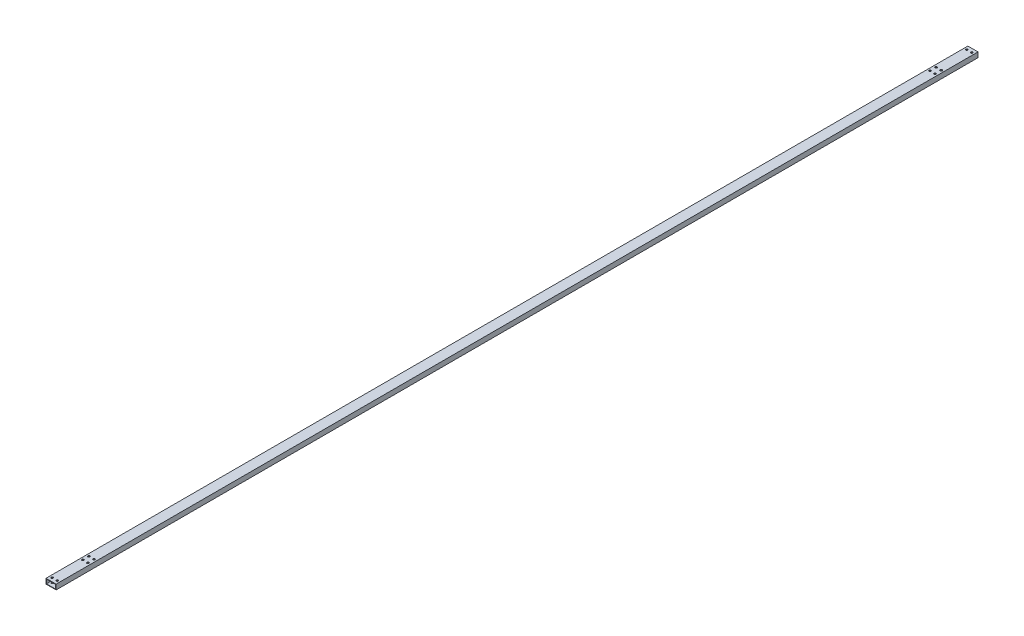
ISO-10303-21;
HEADER;
FILE_DESCRIPTION(('STEP AP214'),'2;1');
FILE_NAME('part.step','',(''),(''),'','','');
FILE_SCHEMA(('AUTOMOTIVE_DESIGN { 1 0 10303 214 1 1 1 1 }'));
ENDSEC;
DATA;
#1=APPLICATION_CONTEXT('core data for automotive mechanical design processes');
#2=APPLICATION_PROTOCOL_DEFINITION('international standard','automotive_design',2000,#1);
#3=PRODUCT_CONTEXT('',#1,'mechanical');
#4=PRODUCT('Part','Part','',(#3));
#5=PRODUCT_RELATED_PRODUCT_CATEGORY('part','',(#4));
#6=PRODUCT_DEFINITION_FORMATION('','',#4);
#7=PRODUCT_DEFINITION_CONTEXT('part definition',#1,'design');
#8=PRODUCT_DEFINITION('design','',#6,#7);
#9=PRODUCT_DEFINITION_SHAPE('','',#8);
#10=(LENGTH_UNIT() NAMED_UNIT(*) SI_UNIT(.MILLI.,.METRE.));
#11=(NAMED_UNIT(*) PLANE_ANGLE_UNIT() SI_UNIT($,.RADIAN.));
#12=(NAMED_UNIT(*) SI_UNIT($,.STERADIAN.) SOLID_ANGLE_UNIT());
#13=UNCERTAINTY_MEASURE_WITH_UNIT(LENGTH_MEASURE(1.E-05),#10,'distance_accuracy_value','');
#14=(GEOMETRIC_REPRESENTATION_CONTEXT(3) GLOBAL_UNCERTAINTY_ASSIGNED_CONTEXT((#13)) GLOBAL_UNIT_ASSIGNED_CONTEXT((#10,
#11,#12)) REPRESENTATION_CONTEXT('',''));
#15=CARTESIAN_POINT('',(0.,0.,0.));
#16=DIRECTION('',(0.,0.,1.));
#17=DIRECTION('',(1.,0.,0.));
#18=AXIS2_PLACEMENT_3D('',#15,#16,#17);
#19=CARTESIAN_POINT('',(0.,0.,1820.));
#20=DIRECTION('',(0.,0.,-1.));
#21=DIRECTION('',(-1.,0.,0.));
#22=AXIS2_PLACEMENT_3D('',#19,#20,#21);
#23=PLANE('',#22);
#24=DIRECTION('',(0.,-1.,0.));
#25=VECTOR('',#24,1.);
#26=CARTESIAN_POINT('',(0.,0.,1820.));
#27=LINE('',#26,#25);
#28=CARTESIAN_POINT('',(0.,10.,1820.));
#29=VERTEX_POINT('',#28);
#30=CARTESIAN_POINT('',(0.,0.,1820.));
#31=VERTEX_POINT('',#30);
#32=EDGE_CURVE('E140',#29,#31,#27,.T.);
#33=ORIENTED_EDGE('',*,*,#32,.T.);
#34=DIRECTION('',(1.,0.,0.));
#35=VECTOR('',#34,1.);
#36=CARTESIAN_POINT('',(0.,0.,1820.));
#37=LINE('',#36,#35);
#38=CARTESIAN_POINT('',(20.,0.,1820.));
#39=VERTEX_POINT('',#38);
#40=EDGE_CURVE('E143',#31,#39,#37,.T.);
#41=ORIENTED_EDGE('',*,*,#40,.T.);
#42=DIRECTION('',(0.,1.,0.));
#43=VECTOR('',#42,1.);
#44=CARTESIAN_POINT('',(20.,0.,1820.));
#45=LINE('',#44,#43);
#46=CARTESIAN_POINT('',(20.,10.,1820.));
#47=VERTEX_POINT('',#46);
#48=EDGE_CURVE('E146',#39,#47,#45,.T.);
#49=ORIENTED_EDGE('',*,*,#48,.T.);
#50=DIRECTION('',(-1.,0.,0.));
#51=VECTOR('',#50,1.);
#52=CARTESIAN_POINT('',(0.,10.,1820.));
#53=LINE('',#52,#51);
#54=EDGE_CURVE('E148',#47,#29,#53,.T.);
#55=ORIENTED_EDGE('',*,*,#54,.T.);
#56=EDGE_LOOP('',(#33,#41,#49,#55));
#57=FACE_BOUND('',#56,.T.);
#58=DIRECTION('',(0.,-1.,0.));
#59=VECTOR('',#58,1.);
#60=CARTESIAN_POINT('',(1.,1.,1820.));
#61=LINE('',#60,#59);
#62=CARTESIAN_POINT('',(1.,9.,1820.));
#63=VERTEX_POINT('',#62);
#64=CARTESIAN_POINT('',(1.,1.,1820.));
#65=VERTEX_POINT('',#64);
#66=EDGE_CURVE('E102',#63,#65,#61,.T.);
#67=ORIENTED_EDGE('',*,*,#66,.F.);
#68=DIRECTION('',(-1.,0.,0.));
#69=VECTOR('',#68,1.);
#70=CARTESIAN_POINT('',(1.,9.,1820.));
#71=LINE('',#70,#69);
#72=CARTESIAN_POINT('',(19.,9.,1820.));
#73=VERTEX_POINT('',#72);
#74=EDGE_CURVE('E124',#73,#63,#71,.T.);
#75=ORIENTED_EDGE('',*,*,#74,.F.);
#76=DIRECTION('',(0.,1.,0.));
#77=VECTOR('',#76,1.);
#78=CARTESIAN_POINT('',(19.,1.,1820.));
#79=LINE('',#78,#77);
#80=CARTESIAN_POINT('',(19.,1.,1820.));
#81=VERTEX_POINT('',#80);
#82=EDGE_CURVE('E122',#81,#73,#79,.T.);
#83=ORIENTED_EDGE('',*,*,#82,.F.);
#84=DIRECTION('',(1.,0.,0.));
#85=VECTOR('',#84,1.);
#86=CARTESIAN_POINT('',(1.,1.,1820.));
#87=LINE('',#86,#85);
#88=EDGE_CURVE('E110',#65,#81,#87,.T.);
#89=ORIENTED_EDGE('',*,*,#88,.F.);
#90=EDGE_LOOP('',(#67,#75,#83,#89));
#91=FACE_BOUND('',#90,.T.);
#92=ADVANCED_FACE('F35',(#57,#91),#23,.F.);
#93=CARTESIAN_POINT('',(0.,0.,0.));
#94=DIRECTION('',(0.,0.,-1.));
#95=DIRECTION('',(-1.,0.,0.));
#96=AXIS2_PLACEMENT_3D('',#93,#94,#95);
#97=PLANE('',#96);
#98=DIRECTION('',(0.,-1.,0.));
#99=VECTOR('',#98,1.);
#100=CARTESIAN_POINT('',(0.,0.,0.));
#101=LINE('',#100,#99);
#102=CARTESIAN_POINT('',(0.,10.,0.));
#103=VERTEX_POINT('',#102);
#104=CARTESIAN_POINT('',(0.,0.,0.));
#105=VERTEX_POINT('',#104);
#106=EDGE_CURVE('E118',#103,#105,#101,.T.);
#107=ORIENTED_EDGE('',*,*,#106,.F.);
#108=DIRECTION('',(-1.,0.,0.));
#109=VECTOR('',#108,1.);
#110=CARTESIAN_POINT('',(0.,10.,0.));
#111=LINE('',#110,#109);
#112=CARTESIAN_POINT('',(20.,10.,0.));
#113=VERTEX_POINT('',#112);
#114=EDGE_CURVE('E144',#113,#103,#111,.T.);
#115=ORIENTED_EDGE('',*,*,#114,.F.);
#116=DIRECTION('',(0.,1.,0.));
#117=VECTOR('',#116,1.);
#118=CARTESIAN_POINT('',(20.,0.,0.));
#119=LINE('',#118,#117);
#120=CARTESIAN_POINT('',(20.,0.,0.));
#121=VERTEX_POINT('',#120);
#122=EDGE_CURVE('E155',#121,#113,#119,.T.);
#123=ORIENTED_EDGE('',*,*,#122,.F.);
#124=DIRECTION('',(1.,0.,0.));
#125=VECTOR('',#124,1.);
#126=CARTESIAN_POINT('',(0.,0.,0.));
#127=LINE('',#126,#125);
#128=EDGE_CURVE('E153',#105,#121,#127,.T.);
#129=ORIENTED_EDGE('',*,*,#128,.F.);
#130=EDGE_LOOP('',(#107,#115,#123,#129));
#131=FACE_BOUND('',#130,.T.);
#132=DIRECTION('',(-1.,0.,0.));
#133=VECTOR('',#132,1.);
#134=CARTESIAN_POINT('',(1.,9.,0.));
#135=LINE('',#134,#133);
#136=CARTESIAN_POINT('',(19.,9.,0.));
#137=VERTEX_POINT('',#136);
#138=CARTESIAN_POINT('',(1.,9.,0.));
#139=VERTEX_POINT('',#138);
#140=EDGE_CURVE('E111',#137,#139,#135,.T.);
#141=ORIENTED_EDGE('',*,*,#140,.T.);
#142=DIRECTION('',(0.,-1.,0.));
#143=VECTOR('',#142,1.);
#144=CARTESIAN_POINT('',(1.,1.,0.));
#145=LINE('',#144,#143);
#146=CARTESIAN_POINT('',(1.,1.,0.));
#147=VERTEX_POINT('',#146);
#148=EDGE_CURVE('E60',#139,#147,#145,.T.);
#149=ORIENTED_EDGE('',*,*,#148,.T.);
#150=DIRECTION('',(1.,0.,0.));
#151=VECTOR('',#150,1.);
#152=CARTESIAN_POINT('',(1.,1.,0.));
#153=LINE('',#152,#151);
#154=CARTESIAN_POINT('',(19.,1.,0.));
#155=VERTEX_POINT('',#154);
#156=EDGE_CURVE('E117',#147,#155,#153,.T.);
#157=ORIENTED_EDGE('',*,*,#156,.T.);
#158=DIRECTION('',(0.,1.,0.));
#159=VECTOR('',#158,1.);
#160=CARTESIAN_POINT('',(19.,1.,0.));
#161=LINE('',#160,#159);
#162=EDGE_CURVE('E132',#155,#137,#161,.T.);
#163=ORIENTED_EDGE('',*,*,#162,.T.);
#164=EDGE_LOOP('',(#141,#149,#157,#163));
#165=FACE_BOUND('',#164,.T.);
#166=ADVANCED_FACE('F255',(#131,#165),#97,.T.);
#167=CARTESIAN_POINT('',(0.,0.,1820.));
#168=DIRECTION('',(1.,0.,0.));
#169=DIRECTION('',(0.,0.,-1.));
#170=AXIS2_PLACEMENT_3D('',#167,#168,#169);
#171=PLANE('',#170);
#172=ORIENTED_EDGE('',*,*,#106,.T.);
#173=DIRECTION('',(0.,0.,-1.));
#174=VECTOR('',#173,1.);
#175=CARTESIAN_POINT('',(0.,0.,1820.));
#176=LINE('',#175,#174);
#177=EDGE_CURVE('E11',#31,#105,#176,.T.);
#178=ORIENTED_EDGE('',*,*,#177,.F.);
#179=ORIENTED_EDGE('',*,*,#32,.F.);
#180=DIRECTION('',(0.,0.,-1.));
#181=VECTOR('',#180,1.);
#182=CARTESIAN_POINT('',(0.,10.,1820.));
#183=LINE('',#182,#181);
#184=EDGE_CURVE('E150',#29,#103,#183,.T.);
#185=ORIENTED_EDGE('',*,*,#184,.T.);
#186=EDGE_LOOP('',(#172,#178,#179,#185));
#187=FACE_BOUND('',#186,.T.);
#188=ADVANCED_FACE('F37',(#187),#171,.F.);
#189=CARTESIAN_POINT('',(0.,0.,1820.));
#190=DIRECTION('',(0.,1.,0.));
#191=DIRECTION('',(0.,0.,1.));
#192=AXIS2_PLACEMENT_3D('',#189,#190,#191);
#193=PLANE('',#192);
#194=CARTESIAN_POINT('',(15.0000000000001,0.,67.8000000000008));
#195=DIRECTION('',(0.,-1.,0.));
#196=DIRECTION('',(0.,0.,-1.));
#197=AXIS2_PLACEMENT_3D('',#194,#195,#196);
#198=CIRCLE('',#197,2.);
#199=CARTESIAN_POINT('',(15.0000000000001,0.,65.8000000000008));
#200=VERTEX_POINT('',#199);
#201=EDGE_CURVE('E291',#200,#200,#198,.T.);
#202=ORIENTED_EDGE('',*,*,#201,.F.);
#203=EDGE_LOOP('',(#202));
#204=FACE_BOUND('',#203,.T.);
#205=CARTESIAN_POINT('',(15.0000000000001,0.,7.20000000000084));
#206=DIRECTION('',(0.,-1.,0.));
#207=DIRECTION('',(0.,0.,-1.));
#208=AXIS2_PLACEMENT_3D('',#205,#206,#207);
#209=CIRCLE('',#208,2.00000000000001);
#210=CARTESIAN_POINT('',(15.0000000000001,0.,5.20000000000084));
#211=VERTEX_POINT('',#210);
#212=EDGE_CURVE('E295',#211,#211,#209,.T.);
#213=ORIENTED_EDGE('',*,*,#212,.F.);
#214=EDGE_LOOP('',(#213));
#215=FACE_BOUND('',#214,.T.);
#216=CARTESIAN_POINT('',(5.00000000000005,0.,7.20000000000084));
#217=DIRECTION('',(0.,-1.,0.));
#218=DIRECTION('',(0.,0.,-1.));
#219=AXIS2_PLACEMENT_3D('',#216,#217,#218);
#220=CIRCLE('',#219,2.);
#221=CARTESIAN_POINT('',(5.00000000000005,0.,5.20000000000084));
#222=VERTEX_POINT('',#221);
#223=EDGE_CURVE('E299',#222,#222,#220,.T.);
#224=ORIENTED_EDGE('',*,*,#223,.F.);
#225=EDGE_LOOP('',(#224));
#226=FACE_BOUND('',#225,.T.);
#227=CARTESIAN_POINT('',(5.00000000000093,0.,1752.2));
#228=DIRECTION('',(0.,-1.,0.));
#229=DIRECTION('',(0.,0.,-1.));
#230=AXIS2_PLACEMENT_3D('',#227,#228,#229);
#231=CIRCLE('',#230,2.);
#232=CARTESIAN_POINT('',(5.00000000000093,0.,1750.2));
#233=VERTEX_POINT('',#232);
#234=EDGE_CURVE('E303',#233,#233,#231,.T.);
#235=ORIENTED_EDGE('',*,*,#234,.F.);
#236=EDGE_LOOP('',(#235));
#237=FACE_BOUND('',#236,.T.);
#238=CARTESIAN_POINT('',(5.00000000000093,0.,1740.2));
#239=DIRECTION('',(0.,-1.,0.));
#240=DIRECTION('',(0.,0.,-1.));
#241=AXIS2_PLACEMENT_3D('',#238,#239,#240);
#242=CIRCLE('',#241,2.);
#243=CARTESIAN_POINT('',(5.00000000000093,0.,1738.2));
#244=VERTEX_POINT('',#243);
#245=EDGE_CURVE('E307',#244,#244,#242,.T.);
#246=ORIENTED_EDGE('',*,*,#245,.F.);
#247=EDGE_LOOP('',(#246));
#248=FACE_BOUND('',#247,.T.);
#249=CARTESIAN_POINT('',(15.0000000000009,0.,1740.2));
#250=DIRECTION('',(0.,-1.,0.));
#251=DIRECTION('',(0.,0.,-1.));
#252=AXIS2_PLACEMENT_3D('',#249,#250,#251);
#253=CIRCLE('',#252,2.00000000000001);
#254=CARTESIAN_POINT('',(15.0000000000009,0.,1738.2));
#255=VERTEX_POINT('',#254);
#256=EDGE_CURVE('E311',#255,#255,#253,.T.);
#257=ORIENTED_EDGE('',*,*,#256,.F.);
#258=EDGE_LOOP('',(#257));
#259=FACE_BOUND('',#258,.T.);
#260=CARTESIAN_POINT('',(15.0000000000009,0.,1752.2));
#261=DIRECTION('',(0.,-1.,0.));
#262=DIRECTION('',(0.,0.,-1.));
#263=AXIS2_PLACEMENT_3D('',#260,#261,#262);
#264=CIRCLE('',#263,2.);
#265=CARTESIAN_POINT('',(15.0000000000009,0.,1750.2));
#266=VERTEX_POINT('',#265);
#267=EDGE_CURVE('E315',#266,#266,#264,.T.);
#268=ORIENTED_EDGE('',*,*,#267,.F.);
#269=EDGE_LOOP('',(#268));
#270=FACE_BOUND('',#269,.T.);
#271=CARTESIAN_POINT('',(15.000000000001,0.,1812.8));
#272=DIRECTION('',(0.,-1.,0.));
#273=DIRECTION('',(0.,0.,-1.));
#274=AXIS2_PLACEMENT_3D('',#271,#272,#273);
#275=CIRCLE('',#274,2.00000000000001);
#276=CARTESIAN_POINT('',(15.000000000001,0.,1810.8));
#277=VERTEX_POINT('',#276);
#278=EDGE_CURVE('E319',#277,#277,#275,.T.);
#279=ORIENTED_EDGE('',*,*,#278,.F.);
#280=EDGE_LOOP('',(#279));
#281=FACE_BOUND('',#280,.T.);
#282=CARTESIAN_POINT('',(15.0000000000001,0.,79.8000000000008));
#283=DIRECTION('',(0.,-1.,0.));
#284=DIRECTION('',(0.,0.,-1.));
#285=AXIS2_PLACEMENT_3D('',#282,#283,#284);
#286=CIRCLE('',#285,2.00000000000001);
#287=CARTESIAN_POINT('',(15.0000000000001,0.,77.8000000000008));
#288=VERTEX_POINT('',#287);
#289=EDGE_CURVE('E323',#288,#288,#286,.T.);
#290=ORIENTED_EDGE('',*,*,#289,.F.);
#291=EDGE_LOOP('',(#290));
#292=FACE_BOUND('',#291,.T.);
#293=CARTESIAN_POINT('',(5.00000000000005,0.,79.8000000000008));
#294=DIRECTION('',(0.,-1.,0.));
#295=DIRECTION('',(0.,0.,-1.));
#296=AXIS2_PLACEMENT_3D('',#293,#294,#295);
#297=CIRCLE('',#296,2.);
#298=CARTESIAN_POINT('',(5.00000000000005,0.,77.8000000000008));
#299=VERTEX_POINT('',#298);
#300=EDGE_CURVE('E327',#299,#299,#297,.T.);
#301=ORIENTED_EDGE('',*,*,#300,.F.);
#302=EDGE_LOOP('',(#301));
#303=FACE_BOUND('',#302,.T.);
#304=CARTESIAN_POINT('',(5.00000000000004,0.,67.8000000000008));
#305=DIRECTION('',(0.,-1.,0.));
#306=DIRECTION('',(0.,0.,-1.));
#307=AXIS2_PLACEMENT_3D('',#304,#305,#306);
#308=CIRCLE('',#307,2.);
#309=CARTESIAN_POINT('',(5.00000000000004,0.,65.8000000000008));
#310=VERTEX_POINT('',#309);
#311=EDGE_CURVE('E331',#310,#310,#308,.T.);
#312=ORIENTED_EDGE('',*,*,#311,.F.);
#313=EDGE_LOOP('',(#312));
#314=FACE_BOUND('',#313,.T.);
#315=CARTESIAN_POINT('',(5.00000000000095,0.,1812.8));
#316=DIRECTION('',(0.,-1.,0.));
#317=DIRECTION('',(0.,0.,-1.));
#318=AXIS2_PLACEMENT_3D('',#315,#316,#317);
#319=CIRCLE('',#318,2.);
#320=CARTESIAN_POINT('',(5.00000000000095,0.,1810.8));
#321=VERTEX_POINT('',#320);
#322=EDGE_CURVE('E335',#321,#321,#319,.T.);
#323=ORIENTED_EDGE('',*,*,#322,.F.);
#324=EDGE_LOOP('',(#323));
#325=FACE_BOUND('',#324,.T.);
#326=ORIENTED_EDGE('',*,*,#128,.T.);
#327=DIRECTION('',(0.,0.,-1.));
#328=VECTOR('',#327,1.);
#329=CARTESIAN_POINT('',(20.,0.,1820.));
#330=LINE('',#329,#328);
#331=EDGE_CURVE('E44',#39,#121,#330,.T.);
#332=ORIENTED_EDGE('',*,*,#331,.F.);
#333=ORIENTED_EDGE('',*,*,#40,.F.);
#334=ORIENTED_EDGE('',*,*,#177,.T.);
#335=EDGE_LOOP('',(#326,#332,#333,#334));
#336=FACE_BOUND('',#335,.T.);
#337=ADVANCED_FACE('F280',(#204,#215,#226,#237,#248,#259,#270,#281,#292,#303,#314,#325,#336),
#193,.F.);
#338=CARTESIAN_POINT('',(20.,0.,1820.));
#339=DIRECTION('',(-1.,0.,0.));
#340=DIRECTION('',(0.,0.,1.));
#341=AXIS2_PLACEMENT_3D('',#338,#339,#340);
#342=PLANE('',#341);
#343=ORIENTED_EDGE('',*,*,#122,.T.);
#344=DIRECTION('',(0.,0.,-1.));
#345=VECTOR('',#344,1.);
#346=CARTESIAN_POINT('',(20.,10.,1820.));
#347=LINE('',#346,#345);
#348=EDGE_CURVE('E160',#47,#113,#347,.T.);
#349=ORIENTED_EDGE('',*,*,#348,.F.);
#350=ORIENTED_EDGE('',*,*,#48,.F.);
#351=ORIENTED_EDGE('',*,*,#331,.T.);
#352=EDGE_LOOP('',(#343,#349,#350,#351));
#353=FACE_BOUND('',#352,.T.);
#354=ADVANCED_FACE('F277',(#353),#342,.F.);
#355=CARTESIAN_POINT('',(0.,10.,1820.));
#356=DIRECTION('',(0.,-1.,0.));
#357=DIRECTION('',(0.,0.,-1.));
#358=AXIS2_PLACEMENT_3D('',#355,#356,#357);
#359=PLANE('',#358);
#360=CARTESIAN_POINT('',(15.0000000000001,10.,67.8000000000008));
#361=DIRECTION('',(0.,-1.,0.));
#362=DIRECTION('',(0.,0.,-1.));
#363=AXIS2_PLACEMENT_3D('',#360,#361,#362);
#364=CIRCLE('',#363,2.);
#365=CARTESIAN_POINT('',(15.0000000000001,10.,65.8000000000008));
#366=VERTEX_POINT('',#365);
#367=EDGE_CURVE('E495',#366,#366,#364,.T.);
#368=ORIENTED_EDGE('',*,*,#367,.T.);
#369=EDGE_LOOP('',(#368));
#370=FACE_BOUND('',#369,.T.);
#371=CARTESIAN_POINT('',(15.0000000000001,10.,7.20000000000084));
#372=DIRECTION('',(0.,-1.,0.));
#373=DIRECTION('',(0.,0.,-1.));
#374=AXIS2_PLACEMENT_3D('',#371,#372,#373);
#375=CIRCLE('',#374,2.00000000000001);
#376=CARTESIAN_POINT('',(15.0000000000001,10.,5.20000000000084));
#377=VERTEX_POINT('',#376);
#378=EDGE_CURVE('E491',#377,#377,#375,.T.);
#379=ORIENTED_EDGE('',*,*,#378,.T.);
#380=EDGE_LOOP('',(#379));
#381=FACE_BOUND('',#380,.T.);
#382=CARTESIAN_POINT('',(5.00000000000005,10.,7.20000000000084));
#383=DIRECTION('',(0.,-1.,0.));
#384=DIRECTION('',(0.,0.,-1.));
#385=AXIS2_PLACEMENT_3D('',#382,#383,#384);
#386=CIRCLE('',#385,2.);
#387=CARTESIAN_POINT('',(5.00000000000005,10.,5.20000000000084));
#388=VERTEX_POINT('',#387);
#389=EDGE_CURVE('E483',#388,#388,#386,.T.);
#390=ORIENTED_EDGE('',*,*,#389,.T.);
#391=EDGE_LOOP('',(#390));
#392=FACE_BOUND('',#391,.T.);
#393=CARTESIAN_POINT('',(5.00000000000093,10.,1752.2));
#394=DIRECTION('',(0.,-1.,0.));
#395=DIRECTION('',(0.,0.,-1.));
#396=AXIS2_PLACEMENT_3D('',#393,#394,#395);
#397=CIRCLE('',#396,2.);
#398=CARTESIAN_POINT('',(5.00000000000093,10.,1750.2));
#399=VERTEX_POINT('',#398);
#400=EDGE_CURVE('E478',#399,#399,#397,.T.);
#401=ORIENTED_EDGE('',*,*,#400,.T.);
#402=EDGE_LOOP('',(#401));
#403=FACE_BOUND('',#402,.T.);
#404=CARTESIAN_POINT('',(5.00000000000093,10.,1740.2));
#405=DIRECTION('',(0.,-1.,0.));
#406=DIRECTION('',(0.,0.,-1.));
#407=AXIS2_PLACEMENT_3D('',#404,#405,#406);
#408=CIRCLE('',#407,2.);
#409=CARTESIAN_POINT('',(5.00000000000093,10.,1738.2));
#410=VERTEX_POINT('',#409);
#411=EDGE_CURVE('E471',#410,#410,#408,.T.);
#412=ORIENTED_EDGE('',*,*,#411,.T.);
#413=EDGE_LOOP('',(#412));
#414=FACE_BOUND('',#413,.T.);
#415=CARTESIAN_POINT('',(15.0000000000009,10.,1740.2));
#416=DIRECTION('',(0.,-1.,0.));
#417=DIRECTION('',(0.,0.,-1.));
#418=AXIS2_PLACEMENT_3D('',#415,#416,#417);
#419=CIRCLE('',#418,2.00000000000001);
#420=CARTESIAN_POINT('',(15.0000000000009,10.,1738.2));
#421=VERTEX_POINT('',#420);
#422=EDGE_CURVE('E470',#421,#421,#419,.T.);
#423=ORIENTED_EDGE('',*,*,#422,.T.);
#424=EDGE_LOOP('',(#423));
#425=FACE_BOUND('',#424,.T.);
#426=CARTESIAN_POINT('',(15.0000000000009,10.,1752.2));
#427=DIRECTION('',(0.,-1.,0.));
#428=DIRECTION('',(0.,0.,-1.));
#429=AXIS2_PLACEMENT_3D('',#426,#427,#428);
#430=CIRCLE('',#429,2.);
#431=CARTESIAN_POINT('',(15.0000000000009,10.,1750.2));
#432=VERTEX_POINT('',#431);
#433=EDGE_CURVE('E501',#432,#432,#430,.T.);
#434=ORIENTED_EDGE('',*,*,#433,.T.);
#435=EDGE_LOOP('',(#434));
#436=FACE_BOUND('',#435,.T.);
#437=CARTESIAN_POINT('',(15.000000000001,10.,1812.8));
#438=DIRECTION('',(0.,-1.,0.));
#439=DIRECTION('',(0.,0.,-1.));
#440=AXIS2_PLACEMENT_3D('',#437,#438,#439);
#441=CIRCLE('',#440,2.00000000000001);
#442=CARTESIAN_POINT('',(15.000000000001,10.,1810.8));
#443=VERTEX_POINT('',#442);
#444=EDGE_CURVE('E348',#443,#443,#441,.T.);
#445=ORIENTED_EDGE('',*,*,#444,.T.);
#446=EDGE_LOOP('',(#445));
#447=FACE_BOUND('',#446,.T.);
#448=CARTESIAN_POINT('',(15.0000000000001,10.,79.8000000000008));
#449=DIRECTION('',(0.,-1.,0.));
#450=DIRECTION('',(0.,0.,-1.));
#451=AXIS2_PLACEMENT_3D('',#448,#449,#450);
#452=CIRCLE('',#451,2.00000000000001);
#453=CARTESIAN_POINT('',(15.0000000000001,10.,77.8000000000008));
#454=VERTEX_POINT('',#453);
#455=EDGE_CURVE('E498',#454,#454,#452,.T.);
#456=ORIENTED_EDGE('',*,*,#455,.T.);
#457=EDGE_LOOP('',(#456));
#458=FACE_BOUND('',#457,.T.);
#459=CARTESIAN_POINT('',(5.00000000000005,10.,79.8000000000008));
#460=DIRECTION('',(0.,-1.,0.));
#461=DIRECTION('',(0.,0.,-1.));
#462=AXIS2_PLACEMENT_3D('',#459,#460,#461);
#463=CIRCLE('',#462,2.);
#464=CARTESIAN_POINT('',(5.00000000000005,10.,77.8000000000008));
#465=VERTEX_POINT('',#464);
#466=EDGE_CURVE('E516',#465,#465,#463,.T.);
#467=ORIENTED_EDGE('',*,*,#466,.T.);
#468=EDGE_LOOP('',(#467));
#469=FACE_BOUND('',#468,.T.);
#470=CARTESIAN_POINT('',(5.00000000000004,10.,67.8000000000008));
#471=DIRECTION('',(0.,-1.,0.));
#472=DIRECTION('',(0.,0.,-1.));
#473=AXIS2_PLACEMENT_3D('',#470,#471,#472);
#474=CIRCLE('',#473,2.);
#475=CARTESIAN_POINT('',(5.00000000000004,10.,65.8000000000008));
#476=VERTEX_POINT('',#475);
#477=EDGE_CURVE('E519',#476,#476,#474,.T.);
#478=ORIENTED_EDGE('',*,*,#477,.T.);
#479=EDGE_LOOP('',(#478));
#480=FACE_BOUND('',#479,.T.);
#481=CARTESIAN_POINT('',(5.00000000000095,10.,1812.8));
#482=DIRECTION('',(0.,-1.,0.));
#483=DIRECTION('',(0.,0.,-1.));
#484=AXIS2_PLACEMENT_3D('',#481,#482,#483);
#485=CIRCLE('',#484,2.);
#486=CARTESIAN_POINT('',(5.00000000000095,10.,1810.8));
#487=VERTEX_POINT('',#486);
#488=EDGE_CURVE('E169',#487,#487,#485,.T.);
#489=ORIENTED_EDGE('',*,*,#488,.T.);
#490=EDGE_LOOP('',(#489));
#491=FACE_BOUND('',#490,.T.);
#492=ORIENTED_EDGE('',*,*,#114,.T.);
#493=ORIENTED_EDGE('',*,*,#184,.F.);
#494=ORIENTED_EDGE('',*,*,#54,.F.);
#495=ORIENTED_EDGE('',*,*,#348,.T.);
#496=EDGE_LOOP('',(#492,#493,#494,#495));
#497=FACE_BOUND('',#496,.T.);
#498=ADVANCED_FACE('F274',(#370,#381,#392,#403,#414,#425,#436,#447,#458,#469,#480,#491,#497),
#359,.F.);
#499=CARTESIAN_POINT('',(1.,1.,1820.));
#500=DIRECTION('',(1.,0.,0.));
#501=DIRECTION('',(0.,0.,-1.));
#502=AXIS2_PLACEMENT_3D('',#499,#500,#501);
#503=PLANE('',#502);
#504=ORIENTED_EDGE('',*,*,#148,.F.);
#505=DIRECTION('',(0.,0.,-1.));
#506=VECTOR('',#505,1.);
#507=CARTESIAN_POINT('',(1.,9.,1820.));
#508=LINE('',#507,#506);
#509=EDGE_CURVE('E106',#63,#139,#508,.T.);
#510=ORIENTED_EDGE('',*,*,#509,.F.);
#511=ORIENTED_EDGE('',*,*,#66,.T.);
#512=DIRECTION('',(0.,0.,-1.));
#513=VECTOR('',#512,1.);
#514=CARTESIAN_POINT('',(1.,1.,1820.));
#515=LINE('',#514,#513);
#516=EDGE_CURVE('E105',#65,#147,#515,.T.);
#517=ORIENTED_EDGE('',*,*,#516,.T.);
#518=EDGE_LOOP('',(#504,#510,#511,#517));
#519=FACE_BOUND('',#518,.T.);
#520=ADVANCED_FACE('F104',(#519),#503,.T.);
#521=CARTESIAN_POINT('',(1.,1.,1820.));
#522=DIRECTION('',(0.,1.,0.));
#523=DIRECTION('',(0.,0.,1.));
#524=AXIS2_PLACEMENT_3D('',#521,#522,#523);
#525=PLANE('',#524);
#526=CARTESIAN_POINT('',(15.0000000000001,0.999999999999999,67.8000000000008));
#527=DIRECTION('',(0.,1.,0.));
#528=DIRECTION('',(0.,0.,1.));
#529=AXIS2_PLACEMENT_3D('',#526,#527,#528);
#530=CIRCLE('',#529,2.);
#531=CARTESIAN_POINT('',(15.0000000000001,0.999999999999999,69.8000000000008));
#532=VERTEX_POINT('',#531);
#533=EDGE_CURVE('E130',#532,#532,#530,.T.);
#534=ORIENTED_EDGE('',*,*,#533,.F.);
#535=EDGE_LOOP('',(#534));
#536=FACE_BOUND('',#535,.T.);
#537=CARTESIAN_POINT('',(15.0000000000001,0.999999999999999,7.20000000000084));
#538=DIRECTION('',(0.,1.,0.));
#539=DIRECTION('',(0.,0.,1.));
#540=AXIS2_PLACEMENT_3D('',#537,#538,#539);
#541=CIRCLE('',#540,2.00000000000001);
#542=CARTESIAN_POINT('',(15.0000000000001,0.999999999999999,9.20000000000085));
#543=VERTEX_POINT('',#542);
#544=EDGE_CURVE('E207',#543,#543,#541,.T.);
#545=ORIENTED_EDGE('',*,*,#544,.F.);
#546=EDGE_LOOP('',(#545));
#547=FACE_BOUND('',#546,.T.);
#548=CARTESIAN_POINT('',(5.00000000000005,0.999999999999999,7.20000000000084));
#549=DIRECTION('',(0.,1.,0.));
#550=DIRECTION('',(0.,0.,1.));
#551=AXIS2_PLACEMENT_3D('',#548,#549,#550);
#552=CIRCLE('',#551,2.);
#553=CARTESIAN_POINT('',(5.00000000000005,0.999999999999999,9.20000000000085));
#554=VERTEX_POINT('',#553);
#555=EDGE_CURVE('E204',#554,#554,#552,.T.);
#556=ORIENTED_EDGE('',*,*,#555,.F.);
#557=EDGE_LOOP('',(#556));
#558=FACE_BOUND('',#557,.T.);
#559=CARTESIAN_POINT('',(5.00000000000093,0.999999999999999,1752.2));
#560=DIRECTION('',(0.,1.,0.));
#561=DIRECTION('',(0.,0.,1.));
#562=AXIS2_PLACEMENT_3D('',#559,#560,#561);
#563=CIRCLE('',#562,2.);
#564=CARTESIAN_POINT('',(5.00000000000093,0.999999999999999,1754.2));
#565=VERTEX_POINT('',#564);
#566=EDGE_CURVE('E201',#565,#565,#563,.T.);
#567=ORIENTED_EDGE('',*,*,#566,.F.);
#568=EDGE_LOOP('',(#567));
#569=FACE_BOUND('',#568,.T.);
#570=CARTESIAN_POINT('',(5.00000000000093,0.999999999999999,1740.2));
#571=DIRECTION('',(0.,1.,0.));
#572=DIRECTION('',(0.,0.,1.));
#573=AXIS2_PLACEMENT_3D('',#570,#571,#572);
#574=CIRCLE('',#573,2.);
#575=CARTESIAN_POINT('',(5.00000000000093,0.999999999999999,1742.2));
#576=VERTEX_POINT('',#575);
#577=EDGE_CURVE('E197',#576,#576,#574,.T.);
#578=ORIENTED_EDGE('',*,*,#577,.F.);
#579=EDGE_LOOP('',(#578));
#580=FACE_BOUND('',#579,.T.);
#581=CARTESIAN_POINT('',(15.0000000000009,0.999999999999999,1740.2));
#582=DIRECTION('',(0.,1.,0.));
#583=DIRECTION('',(0.,0.,1.));
#584=AXIS2_PLACEMENT_3D('',#581,#582,#583);
#585=CIRCLE('',#584,2.00000000000001);
#586=CARTESIAN_POINT('',(15.0000000000009,0.999999999999999,1742.2));
#587=VERTEX_POINT('',#586);
#588=EDGE_CURVE('E193',#587,#587,#585,.T.);
#589=ORIENTED_EDGE('',*,*,#588,.F.);
#590=EDGE_LOOP('',(#589));
#591=FACE_BOUND('',#590,.T.);
#592=CARTESIAN_POINT('',(15.0000000000009,0.999999999999999,1752.2));
#593=DIRECTION('',(0.,1.,0.));
#594=DIRECTION('',(0.,0.,1.));
#595=AXIS2_PLACEMENT_3D('',#592,#593,#594);
#596=CIRCLE('',#595,2.);
#597=CARTESIAN_POINT('',(15.0000000000009,0.999999999999999,1754.2));
#598=VERTEX_POINT('',#597);
#599=EDGE_CURVE('E189',#598,#598,#596,.T.);
#600=ORIENTED_EDGE('',*,*,#599,.F.);
#601=EDGE_LOOP('',(#600));
#602=FACE_BOUND('',#601,.T.);
#603=CARTESIAN_POINT('',(15.000000000001,0.999999999999999,1812.8));
#604=DIRECTION('',(0.,1.,0.));
#605=DIRECTION('',(0.,0.,1.));
#606=AXIS2_PLACEMENT_3D('',#603,#604,#605);
#607=CIRCLE('',#606,2.00000000000001);
#608=CARTESIAN_POINT('',(15.000000000001,0.999999999999999,1814.8));
#609=VERTEX_POINT('',#608);
#610=EDGE_CURVE('E185',#609,#609,#607,.T.);
#611=ORIENTED_EDGE('',*,*,#610,.F.);
#612=EDGE_LOOP('',(#611));
#613=FACE_BOUND('',#612,.T.);
#614=CARTESIAN_POINT('',(15.0000000000001,0.999999999999999,79.8000000000008));
#615=DIRECTION('',(0.,1.,0.));
#616=DIRECTION('',(0.,0.,1.));
#617=AXIS2_PLACEMENT_3D('',#614,#615,#616);
#618=CIRCLE('',#617,2.00000000000001);
#619=CARTESIAN_POINT('',(15.0000000000001,0.999999999999999,81.8000000000008));
#620=VERTEX_POINT('',#619);
#621=EDGE_CURVE('E181',#620,#620,#618,.T.);
#622=ORIENTED_EDGE('',*,*,#621,.F.);
#623=EDGE_LOOP('',(#622));
#624=FACE_BOUND('',#623,.T.);
#625=CARTESIAN_POINT('',(5.00000000000005,0.999999999999999,79.8000000000008));
#626=DIRECTION('',(0.,1.,0.));
#627=DIRECTION('',(0.,0.,1.));
#628=AXIS2_PLACEMENT_3D('',#625,#626,#627);
#629=CIRCLE('',#628,2.);
#630=CARTESIAN_POINT('',(5.00000000000005,0.999999999999999,81.8000000000008));
#631=VERTEX_POINT('',#630);
#632=EDGE_CURVE('E177',#631,#631,#629,.T.);
#633=ORIENTED_EDGE('',*,*,#632,.F.);
#634=EDGE_LOOP('',(#633));
#635=FACE_BOUND('',#634,.T.);
#636=CARTESIAN_POINT('',(5.00000000000004,0.999999999999999,67.8000000000008));
#637=DIRECTION('',(0.,1.,0.));
#638=DIRECTION('',(0.,0.,1.));
#639=AXIS2_PLACEMENT_3D('',#636,#637,#638);
#640=CIRCLE('',#639,2.);
#641=CARTESIAN_POINT('',(5.00000000000004,0.999999999999999,69.8000000000008));
#642=VERTEX_POINT('',#641);
#643=EDGE_CURVE('E173',#642,#642,#640,.T.);
#644=ORIENTED_EDGE('',*,*,#643,.F.);
#645=EDGE_LOOP('',(#644));
#646=FACE_BOUND('',#645,.T.);
#647=CARTESIAN_POINT('',(5.00000000000095,0.999999999999999,1812.8));
#648=DIRECTION('',(0.,1.,0.));
#649=DIRECTION('',(0.,0.,1.));
#650=AXIS2_PLACEMENT_3D('',#647,#648,#649);
#651=CIRCLE('',#650,2.);
#652=CARTESIAN_POINT('',(5.00000000000095,0.999999999999999,1814.8));
#653=VERTEX_POINT('',#652);
#654=EDGE_CURVE('E168',#653,#653,#651,.T.);
#655=ORIENTED_EDGE('',*,*,#654,.F.);
#656=EDGE_LOOP('',(#655));
#657=FACE_BOUND('',#656,.T.);
#658=ORIENTED_EDGE('',*,*,#156,.F.);
#659=ORIENTED_EDGE('',*,*,#516,.F.);
#660=ORIENTED_EDGE('',*,*,#88,.T.);
#661=DIRECTION('',(0.,0.,-1.));
#662=VECTOR('',#661,1.);
#663=CARTESIAN_POINT('',(19.,1.,1820.));
#664=LINE('',#663,#662);
#665=EDGE_CURVE('E119',#81,#155,#664,.T.);
#666=ORIENTED_EDGE('',*,*,#665,.T.);
#667=EDGE_LOOP('',(#658,#659,#660,#666));
#668=FACE_BOUND('',#667,.T.);
#669=ADVANCED_FACE('F114',(#536,#547,#558,#569,#580,#591,#602,#613,#624,#635,#646,#657,#668),
#525,.T.);
#670=CARTESIAN_POINT('',(19.,1.,1820.));
#671=DIRECTION('',(-1.,0.,0.));
#672=DIRECTION('',(0.,0.,1.));
#673=AXIS2_PLACEMENT_3D('',#670,#671,#672);
#674=PLANE('',#673);
#675=ORIENTED_EDGE('',*,*,#162,.F.);
#676=ORIENTED_EDGE('',*,*,#665,.F.);
#677=ORIENTED_EDGE('',*,*,#82,.T.);
#678=DIRECTION('',(0.,0.,-1.));
#679=VECTOR('',#678,1.);
#680=CARTESIAN_POINT('',(19.,9.,1820.));
#681=LINE('',#680,#679);
#682=EDGE_CURVE('E52',#73,#137,#681,.T.);
#683=ORIENTED_EDGE('',*,*,#682,.T.);
#684=EDGE_LOOP('',(#675,#676,#677,#683));
#685=FACE_BOUND('',#684,.T.);
#686=ADVANCED_FACE('F231',(#685),#674,.T.);
#687=CARTESIAN_POINT('',(1.,9.,1820.));
#688=DIRECTION('',(0.,-1.,0.));
#689=DIRECTION('',(0.,0.,-1.));
#690=AXIS2_PLACEMENT_3D('',#687,#688,#689);
#691=PLANE('',#690);
#692=CARTESIAN_POINT('',(15.0000000000001,9.,67.8000000000008));
#693=DIRECTION('',(0.,-1.,0.));
#694=DIRECTION('',(0.,0.,-1.));
#695=AXIS2_PLACEMENT_3D('',#692,#693,#694);
#696=CIRCLE('',#695,2.);
#697=CARTESIAN_POINT('',(15.0000000000001,9.,65.8000000000008));
#698=VERTEX_POINT('',#697);
#699=EDGE_CURVE('E39',#698,#698,#696,.T.);
#700=ORIENTED_EDGE('',*,*,#699,.F.);
#701=EDGE_LOOP('',(#700));
#702=FACE_BOUND('',#701,.T.);
#703=CARTESIAN_POINT('',(15.0000000000001,9.,7.20000000000084));
#704=DIRECTION('',(0.,-1.,0.));
#705=DIRECTION('',(0.,0.,-1.));
#706=AXIS2_PLACEMENT_3D('',#703,#704,#705);
#707=CIRCLE('',#706,2.00000000000001);
#708=CARTESIAN_POINT('',(15.0000000000001,9.,5.20000000000084));
#709=VERTEX_POINT('',#708);
#710=EDGE_CURVE('E205',#709,#709,#707,.T.);
#711=ORIENTED_EDGE('',*,*,#710,.F.);
#712=EDGE_LOOP('',(#711));
#713=FACE_BOUND('',#712,.T.);
#714=CARTESIAN_POINT('',(5.00000000000005,9.,7.20000000000084));
#715=DIRECTION('',(0.,-1.,0.));
#716=DIRECTION('',(0.,0.,-1.));
#717=AXIS2_PLACEMENT_3D('',#714,#715,#716);
#718=CIRCLE('',#717,2.);
#719=CARTESIAN_POINT('',(5.00000000000005,9.,5.20000000000084));
#720=VERTEX_POINT('',#719);
#721=EDGE_CURVE('E202',#720,#720,#718,.T.);
#722=ORIENTED_EDGE('',*,*,#721,.F.);
#723=EDGE_LOOP('',(#722));
#724=FACE_BOUND('',#723,.T.);
#725=CARTESIAN_POINT('',(5.00000000000093,9.,1752.2));
#726=DIRECTION('',(0.,-1.,0.));
#727=DIRECTION('',(0.,0.,-1.));
#728=AXIS2_PLACEMENT_3D('',#725,#726,#727);
#729=CIRCLE('',#728,2.);
#730=CARTESIAN_POINT('',(5.00000000000093,9.,1750.2));
#731=VERTEX_POINT('',#730);
#732=EDGE_CURVE('E198',#731,#731,#729,.T.);
#733=ORIENTED_EDGE('',*,*,#732,.F.);
#734=EDGE_LOOP('',(#733));
#735=FACE_BOUND('',#734,.T.);
#736=CARTESIAN_POINT('',(5.00000000000093,9.,1740.2));
#737=DIRECTION('',(0.,-1.,0.));
#738=DIRECTION('',(0.,0.,-1.));
#739=AXIS2_PLACEMENT_3D('',#736,#737,#738);
#740=CIRCLE('',#739,2.);
#741=CARTESIAN_POINT('',(5.00000000000093,9.,1738.2));
#742=VERTEX_POINT('',#741);
#743=EDGE_CURVE('E194',#742,#742,#740,.T.);
#744=ORIENTED_EDGE('',*,*,#743,.F.);
#745=EDGE_LOOP('',(#744));
#746=FACE_BOUND('',#745,.T.);
#747=CARTESIAN_POINT('',(15.0000000000009,9.,1740.2));
#748=DIRECTION('',(0.,-1.,0.));
#749=DIRECTION('',(0.,0.,-1.));
#750=AXIS2_PLACEMENT_3D('',#747,#748,#749);
#751=CIRCLE('',#750,2.00000000000001);
#752=CARTESIAN_POINT('',(15.0000000000009,9.,1738.2));
#753=VERTEX_POINT('',#752);
#754=EDGE_CURVE('E190',#753,#753,#751,.T.);
#755=ORIENTED_EDGE('',*,*,#754,.F.);
#756=EDGE_LOOP('',(#755));
#757=FACE_BOUND('',#756,.T.);
#758=CARTESIAN_POINT('',(15.0000000000009,9.,1752.2));
#759=DIRECTION('',(0.,-1.,0.));
#760=DIRECTION('',(0.,0.,-1.));
#761=AXIS2_PLACEMENT_3D('',#758,#759,#760);
#762=CIRCLE('',#761,2.);
#763=CARTESIAN_POINT('',(15.0000000000009,9.,1750.2));
#764=VERTEX_POINT('',#763);
#765=EDGE_CURVE('E186',#764,#764,#762,.T.);
#766=ORIENTED_EDGE('',*,*,#765,.F.);
#767=EDGE_LOOP('',(#766));
#768=FACE_BOUND('',#767,.T.);
#769=CARTESIAN_POINT('',(15.000000000001,9.,1812.8));
#770=DIRECTION('',(0.,-1.,0.));
#771=DIRECTION('',(0.,0.,-1.));
#772=AXIS2_PLACEMENT_3D('',#769,#770,#771);
#773=CIRCLE('',#772,2.00000000000001);
#774=CARTESIAN_POINT('',(15.000000000001,9.,1810.8));
#775=VERTEX_POINT('',#774);
#776=EDGE_CURVE('E182',#775,#775,#773,.T.);
#777=ORIENTED_EDGE('',*,*,#776,.F.);
#778=EDGE_LOOP('',(#777));
#779=FACE_BOUND('',#778,.T.);
#780=CARTESIAN_POINT('',(15.0000000000001,9.,79.8000000000008));
#781=DIRECTION('',(0.,-1.,0.));
#782=DIRECTION('',(0.,0.,-1.));
#783=AXIS2_PLACEMENT_3D('',#780,#781,#782);
#784=CIRCLE('',#783,2.00000000000001);
#785=CARTESIAN_POINT('',(15.0000000000001,9.,77.8000000000008));
#786=VERTEX_POINT('',#785);
#787=EDGE_CURVE('E178',#786,#786,#784,.T.);
#788=ORIENTED_EDGE('',*,*,#787,.F.);
#789=EDGE_LOOP('',(#788));
#790=FACE_BOUND('',#789,.T.);
#791=CARTESIAN_POINT('',(5.00000000000005,9.,79.8000000000008));
#792=DIRECTION('',(0.,-1.,0.));
#793=DIRECTION('',(0.,0.,-1.));
#794=AXIS2_PLACEMENT_3D('',#791,#792,#793);
#795=CIRCLE('',#794,2.);
#796=CARTESIAN_POINT('',(5.00000000000005,9.,77.8000000000008));
#797=VERTEX_POINT('',#796);
#798=EDGE_CURVE('E174',#797,#797,#795,.T.);
#799=ORIENTED_EDGE('',*,*,#798,.F.);
#800=EDGE_LOOP('',(#799));
#801=FACE_BOUND('',#800,.T.);
#802=CARTESIAN_POINT('',(5.00000000000004,9.,67.8000000000008));
#803=DIRECTION('',(0.,-1.,0.));
#804=DIRECTION('',(0.,0.,-1.));
#805=AXIS2_PLACEMENT_3D('',#802,#803,#804);
#806=CIRCLE('',#805,2.);
#807=CARTESIAN_POINT('',(5.00000000000004,9.,65.8000000000008));
#808=VERTEX_POINT('',#807);
#809=EDGE_CURVE('E170',#808,#808,#806,.T.);
#810=ORIENTED_EDGE('',*,*,#809,.F.);
#811=EDGE_LOOP('',(#810));
#812=FACE_BOUND('',#811,.T.);
#813=CARTESIAN_POINT('',(5.00000000000095,9.,1812.8));
#814=DIRECTION('',(0.,-1.,0.));
#815=DIRECTION('',(0.,0.,-1.));
#816=AXIS2_PLACEMENT_3D('',#813,#814,#815);
#817=CIRCLE('',#816,2.);
#818=CARTESIAN_POINT('',(5.00000000000095,9.,1810.8));
#819=VERTEX_POINT('',#818);
#820=EDGE_CURVE('E165',#819,#819,#817,.T.);
#821=ORIENTED_EDGE('',*,*,#820,.F.);
#822=EDGE_LOOP('',(#821));
#823=FACE_BOUND('',#822,.T.);
#824=ORIENTED_EDGE('',*,*,#140,.F.);
#825=ORIENTED_EDGE('',*,*,#682,.F.);
#826=ORIENTED_EDGE('',*,*,#74,.T.);
#827=ORIENTED_EDGE('',*,*,#509,.T.);
#828=EDGE_LOOP('',(#824,#825,#826,#827));
#829=FACE_BOUND('',#828,.T.);
#830=ADVANCED_FACE('F227',(#702,#713,#724,#735,#746,#757,#768,#779,#790,#801,#812,#823,#829),
#691,.T.);
#831=CARTESIAN_POINT('',(5.00000000000095,10.,1812.8));
#832=DIRECTION('',(0.,-1.,0.));
#833=DIRECTION('',(0.,0.,-1.));
#834=AXIS2_PLACEMENT_3D('',#831,#832,#833);
#835=CYLINDRICAL_SURFACE('',#834,2.);
#836=ORIENTED_EDGE('',*,*,#820,.T.);
#837=EDGE_LOOP('',(#836));
#838=FACE_BOUND('',#837,.T.);
#839=ORIENTED_EDGE('',*,*,#488,.F.);
#840=EDGE_LOOP('',(#839));
#841=FACE_BOUND('',#840,.T.);
#842=ADVANCED_FACE('F230',(#838,#841),#835,.F.);
#843=CARTESIAN_POINT('',(5.00000000000004,10.,67.8000000000008));
#844=DIRECTION('',(0.,-1.,0.));
#845=DIRECTION('',(0.,0.,-1.));
#846=AXIS2_PLACEMENT_3D('',#843,#844,#845);
#847=CYLINDRICAL_SURFACE('',#846,2.);
#848=ORIENTED_EDGE('',*,*,#809,.T.);
#849=EDGE_LOOP('',(#848));
#850=FACE_BOUND('',#849,.T.);
#851=ORIENTED_EDGE('',*,*,#477,.F.);
#852=EDGE_LOOP('',(#851));
#853=FACE_BOUND('',#852,.T.);
#854=ADVANCED_FACE('F401',(#850,#853),#847,.F.);
#855=CARTESIAN_POINT('',(5.00000000000005,10.,79.8000000000008));
#856=DIRECTION('',(0.,-1.,0.));
#857=DIRECTION('',(0.,0.,-1.));
#858=AXIS2_PLACEMENT_3D('',#855,#856,#857);
#859=CYLINDRICAL_SURFACE('',#858,2.);
#860=ORIENTED_EDGE('',*,*,#798,.T.);
#861=EDGE_LOOP('',(#860));
#862=FACE_BOUND('',#861,.T.);
#863=ORIENTED_EDGE('',*,*,#466,.F.);
#864=EDGE_LOOP('',(#863));
#865=FACE_BOUND('',#864,.T.);
#866=ADVANCED_FACE('F411',(#862,#865),#859,.F.);
#867=CARTESIAN_POINT('',(15.0000000000001,10.,79.8000000000008));
#868=DIRECTION('',(0.,-1.,0.));
#869=DIRECTION('',(0.,0.,-1.));
#870=AXIS2_PLACEMENT_3D('',#867,#868,#869);
#871=CYLINDRICAL_SURFACE('',#870,2.00000000000001);
#872=ORIENTED_EDGE('',*,*,#787,.T.);
#873=EDGE_LOOP('',(#872));
#874=FACE_BOUND('',#873,.T.);
#875=ORIENTED_EDGE('',*,*,#455,.F.);
#876=EDGE_LOOP('',(#875));
#877=FACE_BOUND('',#876,.T.);
#878=ADVANCED_FACE('F419',(#874,#877),#871,.F.);
#879=CARTESIAN_POINT('',(15.000000000001,10.,1812.8));
#880=DIRECTION('',(0.,-1.,0.));
#881=DIRECTION('',(0.,0.,-1.));
#882=AXIS2_PLACEMENT_3D('',#879,#880,#881);
#883=CYLINDRICAL_SURFACE('',#882,2.00000000000001);
#884=ORIENTED_EDGE('',*,*,#776,.T.);
#885=EDGE_LOOP('',(#884));
#886=FACE_BOUND('',#885,.T.);
#887=ORIENTED_EDGE('',*,*,#444,.F.);
#888=EDGE_LOOP('',(#887));
#889=FACE_BOUND('',#888,.T.);
#890=ADVANCED_FACE('F439',(#886,#889),#883,.F.);
#891=CARTESIAN_POINT('',(15.0000000000009,10.,1752.2));
#892=DIRECTION('',(0.,-1.,0.));
#893=DIRECTION('',(0.,0.,-1.));
#894=AXIS2_PLACEMENT_3D('',#891,#892,#893);
#895=CYLINDRICAL_SURFACE('',#894,2.);
#896=ORIENTED_EDGE('',*,*,#765,.T.);
#897=EDGE_LOOP('',(#896));
#898=FACE_BOUND('',#897,.T.);
#899=ORIENTED_EDGE('',*,*,#433,.F.);
#900=EDGE_LOOP('',(#899));
#901=FACE_BOUND('',#900,.T.);
#902=ADVANCED_FACE('F442',(#898,#901),#895,.F.);
#903=CARTESIAN_POINT('',(15.0000000000009,10.,1740.2));
#904=DIRECTION('',(0.,-1.,0.));
#905=DIRECTION('',(0.,0.,-1.));
#906=AXIS2_PLACEMENT_3D('',#903,#904,#905);
#907=CYLINDRICAL_SURFACE('',#906,2.00000000000001);
#908=ORIENTED_EDGE('',*,*,#754,.T.);
#909=EDGE_LOOP('',(#908));
#910=FACE_BOUND('',#909,.T.);
#911=ORIENTED_EDGE('',*,*,#422,.F.);
#912=EDGE_LOOP('',(#911));
#913=FACE_BOUND('',#912,.T.);
#914=ADVANCED_FACE('F447',(#910,#913),#907,.F.);
#915=CARTESIAN_POINT('',(5.00000000000093,10.,1740.2));
#916=DIRECTION('',(0.,-1.,0.));
#917=DIRECTION('',(0.,0.,-1.));
#918=AXIS2_PLACEMENT_3D('',#915,#916,#917);
#919=CYLINDRICAL_SURFACE('',#918,2.);
#920=ORIENTED_EDGE('',*,*,#743,.T.);
#921=EDGE_LOOP('',(#920));
#922=FACE_BOUND('',#921,.T.);
#923=ORIENTED_EDGE('',*,*,#411,.F.);
#924=EDGE_LOOP('',(#923));
#925=FACE_BOUND('',#924,.T.);
#926=ADVANCED_FACE('F429',(#922,#925),#919,.F.);
#927=CARTESIAN_POINT('',(5.00000000000093,10.,1752.2));
#928=DIRECTION('',(0.,-1.,0.));
#929=DIRECTION('',(0.,0.,-1.));
#930=AXIS2_PLACEMENT_3D('',#927,#928,#929);
#931=CYLINDRICAL_SURFACE('',#930,2.);
#932=ORIENTED_EDGE('',*,*,#732,.T.);
#933=EDGE_LOOP('',(#932));
#934=FACE_BOUND('',#933,.T.);
#935=ORIENTED_EDGE('',*,*,#400,.F.);
#936=EDGE_LOOP('',(#935));
#937=FACE_BOUND('',#936,.T.);
#938=ADVANCED_FACE('F425',(#934,#937),#931,.F.);
#939=CARTESIAN_POINT('',(5.00000000000005,10.,7.20000000000084));
#940=DIRECTION('',(0.,-1.,0.));
#941=DIRECTION('',(0.,0.,-1.));
#942=AXIS2_PLACEMENT_3D('',#939,#940,#941);
#943=CYLINDRICAL_SURFACE('',#942,2.);
#944=ORIENTED_EDGE('',*,*,#721,.T.);
#945=EDGE_LOOP('',(#944));
#946=FACE_BOUND('',#945,.T.);
#947=ORIENTED_EDGE('',*,*,#389,.F.);
#948=EDGE_LOOP('',(#947));
#949=FACE_BOUND('',#948,.T.);
#950=ADVANCED_FACE('F428',(#946,#949),#943,.F.);
#951=CARTESIAN_POINT('',(15.0000000000001,10.,7.20000000000084));
#952=DIRECTION('',(0.,-1.,0.));
#953=DIRECTION('',(0.,0.,-1.));
#954=AXIS2_PLACEMENT_3D('',#951,#952,#953);
#955=CYLINDRICAL_SURFACE('',#954,2.00000000000001);
#956=ORIENTED_EDGE('',*,*,#710,.T.);
#957=EDGE_LOOP('',(#956));
#958=FACE_BOUND('',#957,.T.);
#959=ORIENTED_EDGE('',*,*,#378,.F.);
#960=EDGE_LOOP('',(#959));
#961=FACE_BOUND('',#960,.T.);
#962=ADVANCED_FACE('F402',(#958,#961),#955,.F.);
#963=CARTESIAN_POINT('',(15.0000000000001,10.,67.8000000000008));
#964=DIRECTION('',(0.,-1.,0.));
#965=DIRECTION('',(0.,0.,-1.));
#966=AXIS2_PLACEMENT_3D('',#963,#964,#965);
#967=CYLINDRICAL_SURFACE('',#966,2.);
#968=ORIENTED_EDGE('',*,*,#699,.T.);
#969=EDGE_LOOP('',(#968));
#970=FACE_BOUND('',#969,.T.);
#971=ORIENTED_EDGE('',*,*,#367,.F.);
#972=EDGE_LOOP('',(#971));
#973=FACE_BOUND('',#972,.T.);
#974=ADVANCED_FACE('F224',(#970,#973),#967,.F.);
#975=ORIENTED_EDGE('',*,*,#654,.T.);
#976=EDGE_LOOP('',(#975));
#977=FACE_BOUND('',#976,.T.);
#978=ORIENTED_EDGE('',*,*,#322,.T.);
#979=EDGE_LOOP('',(#978));
#980=FACE_BOUND('',#979,.T.);
#981=ADVANCED_FACE('F390',(#977,#980),#835,.F.);
#982=ORIENTED_EDGE('',*,*,#643,.T.);
#983=EDGE_LOOP('',(#982));
#984=FACE_BOUND('',#983,.T.);
#985=ORIENTED_EDGE('',*,*,#311,.T.);
#986=EDGE_LOOP('',(#985));
#987=FACE_BOUND('',#986,.T.);
#988=ADVANCED_FACE('F392',(#984,#987),#847,.F.);
#989=ORIENTED_EDGE('',*,*,#632,.T.);
#990=EDGE_LOOP('',(#989));
#991=FACE_BOUND('',#990,.T.);
#992=ORIENTED_EDGE('',*,*,#300,.T.);
#993=EDGE_LOOP('',(#992));
#994=FACE_BOUND('',#993,.T.);
#995=ADVANCED_FACE('F398',(#991,#994),#859,.F.);
#996=ORIENTED_EDGE('',*,*,#621,.T.);
#997=EDGE_LOOP('',(#996));
#998=FACE_BOUND('',#997,.T.);
#999=ORIENTED_EDGE('',*,*,#289,.T.);
#1000=EDGE_LOOP('',(#999));
#1001=FACE_BOUND('',#1000,.T.);
#1002=ADVANCED_FACE('F525',(#998,#1001),#871,.F.);
#1003=ORIENTED_EDGE('',*,*,#610,.T.);
#1004=EDGE_LOOP('',(#1003));
#1005=FACE_BOUND('',#1004,.T.);
#1006=ORIENTED_EDGE('',*,*,#278,.T.);
#1007=EDGE_LOOP('',(#1006));
#1008=FACE_BOUND('',#1007,.T.);
#1009=ADVANCED_FACE('F444',(#1005,#1008),#883,.F.);
#1010=ORIENTED_EDGE('',*,*,#599,.T.);
#1011=EDGE_LOOP('',(#1010));
#1012=FACE_BOUND('',#1011,.T.);
#1013=ORIENTED_EDGE('',*,*,#267,.T.);
#1014=EDGE_LOOP('',(#1013));
#1015=FACE_BOUND('',#1014,.T.);
#1016=ADVANCED_FACE('F449',(#1012,#1015),#895,.F.);
#1017=ORIENTED_EDGE('',*,*,#588,.T.);
#1018=EDGE_LOOP('',(#1017));
#1019=FACE_BOUND('',#1018,.T.);
#1020=ORIENTED_EDGE('',*,*,#256,.T.);
#1021=EDGE_LOOP('',(#1020));
#1022=FACE_BOUND('',#1021,.T.);
#1023=ADVANCED_FACE('F452',(#1019,#1022),#907,.F.);
#1024=ORIENTED_EDGE('',*,*,#577,.T.);
#1025=EDGE_LOOP('',(#1024));
#1026=FACE_BOUND('',#1025,.T.);
#1027=ORIENTED_EDGE('',*,*,#245,.T.);
#1028=EDGE_LOOP('',(#1027));
#1029=FACE_BOUND('',#1028,.T.);
#1030=ADVANCED_FACE('F372',(#1026,#1029),#919,.F.);
#1031=ORIENTED_EDGE('',*,*,#566,.T.);
#1032=EDGE_LOOP('',(#1031));
#1033=FACE_BOUND('',#1032,.T.);
#1034=ORIENTED_EDGE('',*,*,#234,.T.);
#1035=EDGE_LOOP('',(#1034));
#1036=FACE_BOUND('',#1035,.T.);
#1037=ADVANCED_FACE('F431',(#1033,#1036),#931,.F.);
#1038=ORIENTED_EDGE('',*,*,#555,.T.);
#1039=EDGE_LOOP('',(#1038));
#1040=FACE_BOUND('',#1039,.T.);
#1041=ORIENTED_EDGE('',*,*,#223,.T.);
#1042=EDGE_LOOP('',(#1041));
#1043=FACE_BOUND('',#1042,.T.);
#1044=ADVANCED_FACE('F435',(#1040,#1043),#943,.F.);
#1045=ORIENTED_EDGE('',*,*,#544,.T.);
#1046=EDGE_LOOP('',(#1045));
#1047=FACE_BOUND('',#1046,.T.);
#1048=ORIENTED_EDGE('',*,*,#212,.T.);
#1049=EDGE_LOOP('',(#1048));
#1050=FACE_BOUND('',#1049,.T.);
#1051=ADVANCED_FACE('F437',(#1047,#1050),#955,.F.);
#1052=ORIENTED_EDGE('',*,*,#533,.T.);
#1053=EDGE_LOOP('',(#1052));
#1054=FACE_BOUND('',#1053,.T.);
#1055=ORIENTED_EDGE('',*,*,#201,.T.);
#1056=EDGE_LOOP('',(#1055));
#1057=FACE_BOUND('',#1056,.T.);
#1058=ADVANCED_FACE('F404',(#1054,#1057),#967,.F.);
#1059=CLOSED_SHELL('',(#92,#166,#188,#337,#354,#498,#520,#669,#686,#830,#842,#854,#866,#878,
#890,#902,#914,#926,#938,#950,#962,#974,#981,#988,#995,#1002,#1009,#1016,#1023,#1030,#1037,
#1044,#1051,#1058));
#1060=MANIFOLD_SOLID_BREP('B2',#1059);
#1061=ADVANCED_BREP_SHAPE_REPRESENTATION('',(#18,#1060),#14);
#1062=SHAPE_DEFINITION_REPRESENTATION(#9,#1061);
ENDSEC;
END-ISO-10303-21;
